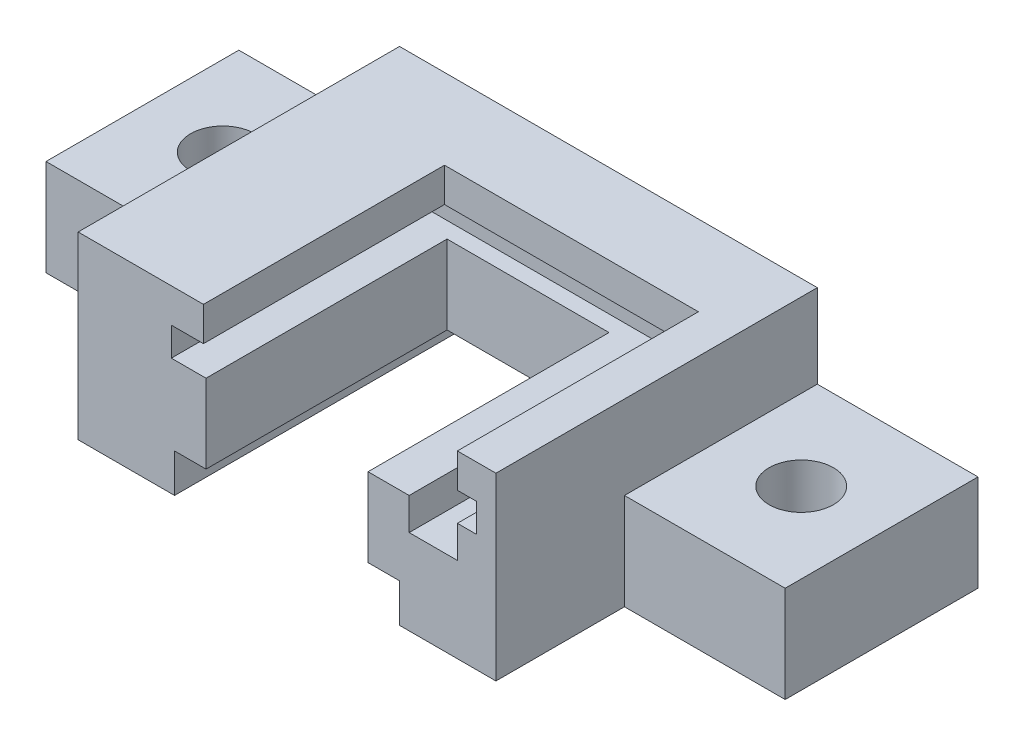
ISO-10303-21;
HEADER;
FILE_DESCRIPTION(('STEP AP214'),'2;1');
FILE_NAME('part.step','',(''),(''),'','','');
FILE_SCHEMA(('AUTOMOTIVE_DESIGN { 1 0 10303 214 1 1 1 1 }'));
ENDSEC;
DATA;
#1=APPLICATION_CONTEXT('core data for automotive mechanical design processes');
#2=APPLICATION_PROTOCOL_DEFINITION('international standard','automotive_design',2000,#1);
#3=PRODUCT_CONTEXT('',#1,'mechanical');
#4=PRODUCT('Part','Part','',(#3));
#5=PRODUCT_RELATED_PRODUCT_CATEGORY('part','',(#4));
#6=PRODUCT_DEFINITION_FORMATION('','',#4);
#7=PRODUCT_DEFINITION_CONTEXT('part definition',#1,'design');
#8=PRODUCT_DEFINITION('design','',#6,#7);
#9=PRODUCT_DEFINITION_SHAPE('','',#8);
#10=(LENGTH_UNIT() NAMED_UNIT(*) SI_UNIT(.MILLI.,.METRE.));
#11=(NAMED_UNIT(*) PLANE_ANGLE_UNIT() SI_UNIT($,.RADIAN.));
#12=(NAMED_UNIT(*) SI_UNIT($,.STERADIAN.) SOLID_ANGLE_UNIT());
#13=UNCERTAINTY_MEASURE_WITH_UNIT(LENGTH_MEASURE(1.E-05),#10,'distance_accuracy_value','');
#14=(GEOMETRIC_REPRESENTATION_CONTEXT(3) GLOBAL_UNCERTAINTY_ASSIGNED_CONTEXT((#13)) GLOBAL_UNIT_ASSIGNED_CONTEXT((#10,
#11,#12)) REPRESENTATION_CONTEXT('',''));
#15=CARTESIAN_POINT('',(0.,0.,0.));
#16=DIRECTION('',(0.,0.,1.));
#17=DIRECTION('',(1.,0.,0.));
#18=AXIS2_PLACEMENT_3D('',#15,#16,#17);
#19=CARTESIAN_POINT('',(13.,5.6,20.));
#20=DIRECTION('',(-1.,0.,0.));
#21=DIRECTION('',(0.,-1.,0.));
#22=AXIS2_PLACEMENT_3D('',#19,#20,#21);
#23=PLANE('',#22);
#24=DIRECTION('',(0.,-1.,0.));
#25=VECTOR('',#24,1.);
#26=CARTESIAN_POINT('',(13.,-5.6,12.));
#27=LINE('',#26,#25);
#28=CARTESIAN_POINT('',(13.,0.400000000000004,12.));
#29=VERTEX_POINT('',#28);
#30=CARTESIAN_POINT('',(13.,-5.6,12.));
#31=VERTEX_POINT('',#30);
#32=EDGE_CURVE('E257',#29,#31,#27,.T.);
#33=ORIENTED_EDGE('',*,*,#32,.F.);
#34=DIRECTION('',(0.,0.,1.));
#35=VECTOR('',#34,1.);
#36=CARTESIAN_POINT('',(13.,0.400000000000004,12.));
#37=LINE('',#36,#35);
#38=CARTESIAN_POINT('',(13.,0.400000000000004,0.));
#39=VERTEX_POINT('',#38);
#40=EDGE_CURVE('E58',#39,#29,#37,.T.);
#41=ORIENTED_EDGE('',*,*,#40,.F.);
#42=DIRECTION('',(0.,1.,0.));
#43=VECTOR('',#42,1.);
#44=CARTESIAN_POINT('',(13.,5.6,0.));
#45=LINE('',#44,#43);
#46=CARTESIAN_POINT('',(13.,5.6,0.));
#47=VERTEX_POINT('',#46);
#48=EDGE_CURVE('E311',#39,#47,#45,.T.);
#49=ORIENTED_EDGE('',*,*,#48,.T.);
#50=DIRECTION('',(0.,0.,-1.));
#51=VECTOR('',#50,1.);
#52=CARTESIAN_POINT('',(13.,5.6,20.));
#53=LINE('',#52,#51);
#54=CARTESIAN_POINT('',(13.,5.6,20.));
#55=VERTEX_POINT('',#54);
#56=EDGE_CURVE('E327',#55,#47,#53,.T.);
#57=ORIENTED_EDGE('',*,*,#56,.F.);
#58=DIRECTION('',(0.,1.,0.));
#59=VECTOR('',#58,1.);
#60=CARTESIAN_POINT('',(13.,5.6,20.));
#61=LINE('',#60,#59);
#62=CARTESIAN_POINT('',(13.,-5.6,20.));
#63=VERTEX_POINT('',#62);
#64=EDGE_CURVE('E346',#63,#55,#61,.T.);
#65=ORIENTED_EDGE('',*,*,#64,.F.);
#66=DIRECTION('',(0.,0.,-1.));
#67=VECTOR('',#66,1.);
#68=CARTESIAN_POINT('',(13.,-5.6,20.));
#69=LINE('',#68,#67);
#70=EDGE_CURVE('E52',#63,#31,#69,.T.);
#71=ORIENTED_EDGE('',*,*,#70,.T.);
#72=EDGE_LOOP('',(#33,#41,#49,#57,#65,#71));
#73=FACE_BOUND('',#72,.T.);
#74=ADVANCED_FACE('F35',(#73),#23,.F.);
#75=CARTESIAN_POINT('',(-13.,5.6,20.));
#76=DIRECTION('',(1.,0.,0.));
#77=DIRECTION('',(0.,1.,0.));
#78=AXIS2_PLACEMENT_3D('',#75,#76,#77);
#79=PLANE('',#78);
#80=DIRECTION('',(0.,1.,0.));
#81=VECTOR('',#80,1.);
#82=CARTESIAN_POINT('',(-13.,0.400000000000004,12.));
#83=LINE('',#82,#81);
#84=CARTESIAN_POINT('',(-13.,-5.6,12.));
#85=VERTEX_POINT('',#84);
#86=CARTESIAN_POINT('',(-13.,0.400000000000004,12.));
#87=VERTEX_POINT('',#86);
#88=EDGE_CURVE('E258',#85,#87,#83,.T.);
#89=ORIENTED_EDGE('',*,*,#88,.F.);
#90=DIRECTION('',(0.,0.,-1.));
#91=VECTOR('',#90,1.);
#92=CARTESIAN_POINT('',(-13.,-5.6,20.));
#93=LINE('',#92,#91);
#94=CARTESIAN_POINT('',(-13.,-5.6,20.));
#95=VERTEX_POINT('',#94);
#96=EDGE_CURVE('E44',#95,#85,#93,.T.);
#97=ORIENTED_EDGE('',*,*,#96,.F.);
#98=DIRECTION('',(0.,-1.,0.));
#99=VECTOR('',#98,1.);
#100=CARTESIAN_POINT('',(-13.,5.6,20.));
#101=LINE('',#100,#99);
#102=CARTESIAN_POINT('',(-13.,5.6,20.));
#103=VERTEX_POINT('',#102);
#104=EDGE_CURVE('E323',#103,#95,#101,.T.);
#105=ORIENTED_EDGE('',*,*,#104,.F.);
#106=DIRECTION('',(0.,0.,-1.));
#107=VECTOR('',#106,1.);
#108=CARTESIAN_POINT('',(-13.,5.6,20.));
#109=LINE('',#108,#107);
#110=CARTESIAN_POINT('',(-13.,5.6,0.));
#111=VERTEX_POINT('',#110);
#112=EDGE_CURVE('E324',#103,#111,#109,.T.);
#113=ORIENTED_EDGE('',*,*,#112,.T.);
#114=DIRECTION('',(0.,-1.,0.));
#115=VECTOR('',#114,1.);
#116=CARTESIAN_POINT('',(-13.,5.6,0.));
#117=LINE('',#116,#115);
#118=CARTESIAN_POINT('',(-13.,0.400000000000002,0.));
#119=VERTEX_POINT('',#118);
#120=EDGE_CURVE('E339',#111,#119,#117,.T.);
#121=ORIENTED_EDGE('',*,*,#120,.T.);
#122=DIRECTION('',(0.,0.,-1.));
#123=VECTOR('',#122,1.);
#124=CARTESIAN_POINT('',(-13.,0.400000000000004,12.));
#125=LINE('',#124,#123);
#126=EDGE_CURVE('E262',#87,#119,#125,.T.);
#127=ORIENTED_EDGE('',*,*,#126,.F.);
#128=EDGE_LOOP('',(#89,#97,#105,#113,#121,#127));
#129=FACE_BOUND('',#128,.T.);
#130=ADVANCED_FACE('F37',(#129),#79,.F.);
#131=CARTESIAN_POINT('',(0.,0.,20.));
#132=DIRECTION('',(0.,0.,1.));
#133=DIRECTION('',(1.,0.,0.));
#134=AXIS2_PLACEMENT_3D('',#131,#132,#133);
#135=PLANE('',#134);
#136=DIRECTION('',(0.,-1.,0.));
#137=VECTOR('',#136,1.);
#138=CARTESIAN_POINT('',(-5.2,5.6,20.));
#139=LINE('',#138,#137);
#140=CARTESIAN_POINT('',(-5.2,5.6,20.));
#141=VERTEX_POINT('',#140);
#142=CARTESIAN_POINT('',(-5.2,3.48000000000001,20.));
#143=VERTEX_POINT('',#142);
#144=EDGE_CURVE('E457',#141,#143,#139,.T.);
#145=ORIENTED_EDGE('',*,*,#144,.F.);
#146=DIRECTION('',(-1.,0.,0.));
#147=VECTOR('',#146,1.);
#148=CARTESIAN_POINT('',(-13.,5.6,20.));
#149=LINE('',#148,#147);
#150=EDGE_CURVE('E345',#141,#103,#149,.T.);
#151=ORIENTED_EDGE('',*,*,#150,.T.);
#152=ORIENTED_EDGE('',*,*,#104,.T.);
#153=DIRECTION('',(1.,0.,0.));
#154=VECTOR('',#153,1.);
#155=CARTESIAN_POINT('',(-13.,-5.6,20.));
#156=LINE('',#155,#154);
#157=CARTESIAN_POINT('',(-6.99999999999999,-5.6,20.));
#158=VERTEX_POINT('',#157);
#159=EDGE_CURVE('E348',#95,#158,#156,.T.);
#160=ORIENTED_EDGE('',*,*,#159,.T.);
#161=DIRECTION('',(0.,-1.,0.));
#162=VECTOR('',#161,1.);
#163=CARTESIAN_POINT('',(-6.99999999999999,-3.2,20.));
#164=LINE('',#163,#162);
#165=CARTESIAN_POINT('',(-6.99999999999999,-3.2,20.));
#166=VERTEX_POINT('',#165);
#167=EDGE_CURVE('E372',#166,#158,#164,.T.);
#168=ORIENTED_EDGE('',*,*,#167,.F.);
#169=DIRECTION('',(-1.,0.,0.));
#170=VECTOR('',#169,1.);
#171=CARTESIAN_POINT('',(-6.99999999999999,-3.2,20.));
#172=LINE('',#171,#170);
#173=CARTESIAN_POINT('',(-5.04,-3.2,20.));
#174=VERTEX_POINT('',#173);
#175=EDGE_CURVE('E368',#174,#166,#172,.T.);
#176=ORIENTED_EDGE('',*,*,#175,.F.);
#177=DIRECTION('',(0.,-1.,0.));
#178=VECTOR('',#177,1.);
#179=CARTESIAN_POINT('',(-5.04,1.7,20.));
#180=LINE('',#179,#178);
#181=CARTESIAN_POINT('',(-5.04,1.7,20.));
#182=VERTEX_POINT('',#181);
#183=EDGE_CURVE('E396',#182,#174,#180,.T.);
#184=ORIENTED_EDGE('',*,*,#183,.F.);
#185=DIRECTION('',(1.,0.,0.));
#186=VECTOR('',#185,1.);
#187=CARTESIAN_POINT('',(-7.2,1.7,20.));
#188=LINE('',#187,#186);
#189=CARTESIAN_POINT('',(-7.2,1.7,20.));
#190=VERTEX_POINT('',#189);
#191=EDGE_CURVE('E426',#190,#182,#188,.T.);
#192=ORIENTED_EDGE('',*,*,#191,.F.);
#193=DIRECTION('',(0.,-1.,0.));
#194=VECTOR('',#193,1.);
#195=CARTESIAN_POINT('',(-7.2,3.48000000000001,20.));
#196=LINE('',#195,#194);
#197=CARTESIAN_POINT('',(-7.2,3.48000000000001,20.));
#198=VERTEX_POINT('',#197);
#199=EDGE_CURVE('E430',#198,#190,#196,.T.);
#200=ORIENTED_EDGE('',*,*,#199,.F.);
#201=DIRECTION('',(-1.,0.,0.));
#202=VECTOR('',#201,1.);
#203=CARTESIAN_POINT('',(-7.2,3.48000000000001,20.));
#204=LINE('',#203,#202);
#205=EDGE_CURVE('E422',#143,#198,#204,.T.);
#206=ORIENTED_EDGE('',*,*,#205,.F.);
#207=EDGE_LOOP('',(#145,#151,#152,#160,#168,#176,#184,#192,#200,#206));
#208=FACE_BOUND('',#207,.T.);
#209=ADVANCED_FACE('F521',(#208),#135,.T.);
#210=CARTESIAN_POINT('',(-13.,-5.6,20.));
#211=DIRECTION('',(0.,1.,0.));
#212=DIRECTION('',(0.,0.,1.));
#213=AXIS2_PLACEMENT_3D('',#210,#211,#212);
#214=PLANE('',#213);
#215=CARTESIAN_POINT('',(-18.,-5.6,6.));
#216=DIRECTION('',(0.,-1.,0.));
#217=DIRECTION('',(0.,0.,-1.));
#218=AXIS2_PLACEMENT_3D('',#215,#216,#217);
#219=CIRCLE('',#218,2.);
#220=CARTESIAN_POINT('',(-18.,-5.6,4.));
#221=VERTEX_POINT('',#220);
#222=EDGE_CURVE('E584',#221,#221,#219,.T.);
#223=ORIENTED_EDGE('',*,*,#222,.F.);
#224=EDGE_LOOP('',(#223));
#225=FACE_BOUND('',#224,.T.);
#226=CARTESIAN_POINT('',(-10.,-5.6,15.));
#227=DIRECTION('',(0.,1.,0.));
#228=DIRECTION('',(0.,0.,1.));
#229=AXIS2_PLACEMENT_3D('',#226,#227,#228);
#230=CIRCLE('',#229,1.5);
#231=CARTESIAN_POINT('',(-10.,-5.6,16.5));
#232=VERTEX_POINT('',#231);
#233=EDGE_CURVE('E333',#232,#232,#230,.T.);
#234=ORIENTED_EDGE('',*,*,#233,.T.);
#235=EDGE_LOOP('',(#234));
#236=FACE_BOUND('',#235,.T.);
#237=CARTESIAN_POINT('',(-10.,-5.6,5.));
#238=DIRECTION('',(0.,1.,0.));
#239=DIRECTION('',(0.,0.,-1.));
#240=AXIS2_PLACEMENT_3D('',#237,#238,#239);
#241=CIRCLE('',#240,1.55);
#242=CARTESIAN_POINT('',(-10.,-5.60000000000001,3.45));
#243=VERTEX_POINT('',#242);
#244=EDGE_CURVE('E336',#243,#243,#241,.T.);
#245=ORIENTED_EDGE('',*,*,#244,.T.);
#246=EDGE_LOOP('',(#245));
#247=FACE_BOUND('',#246,.T.);
#248=DIRECTION('',(1.,0.,0.));
#249=VECTOR('',#248,1.);
#250=CARTESIAN_POINT('',(-13.,-5.6,0.));
#251=LINE('',#250,#249);
#252=CARTESIAN_POINT('',(-23.,-5.6,0.));
#253=VERTEX_POINT('',#252);
#254=CARTESIAN_POINT('',(-6.99999999999999,-5.6,0.));
#255=VERTEX_POINT('',#254);
#256=EDGE_CURVE('E315',#253,#255,#251,.T.);
#257=ORIENTED_EDGE('',*,*,#256,.T.);
#258=DIRECTION('',(0.,0.,1.));
#259=VECTOR('',#258,1.);
#260=CARTESIAN_POINT('',(-6.99999999999999,-5.6,0.));
#261=LINE('',#260,#259);
#262=EDGE_CURVE('E354',#255,#158,#261,.T.);
#263=ORIENTED_EDGE('',*,*,#262,.T.);
#264=ORIENTED_EDGE('',*,*,#159,.F.);
#265=ORIENTED_EDGE('',*,*,#96,.T.);
#266=DIRECTION('',(1.,0.,0.));
#267=VECTOR('',#266,1.);
#268=CARTESIAN_POINT('',(-23.,-5.59999999999999,12.));
#269=LINE('',#268,#267);
#270=CARTESIAN_POINT('',(-23.,-5.59999999999999,12.));
#271=VERTEX_POINT('',#270);
#272=EDGE_CURVE('E289',#271,#85,#269,.T.);
#273=ORIENTED_EDGE('',*,*,#272,.F.);
#274=DIRECTION('',(0.,0.,1.));
#275=VECTOR('',#274,1.);
#276=CARTESIAN_POINT('',(-23.,-5.59999999999999,12.));
#277=LINE('',#276,#275);
#278=EDGE_CURVE('E287',#253,#271,#277,.T.);
#279=ORIENTED_EDGE('',*,*,#278,.F.);
#280=EDGE_LOOP('',(#257,#263,#264,#265,#273,#279));
#281=FACE_BOUND('',#280,.T.);
#282=ADVANCED_FACE('F498',(#225,#236,#247,#281),#214,.F.);
#283=CARTESIAN_POINT('',(18.,-5.6,6.));
#284=DIRECTION('',(0.,-1.,0.));
#285=DIRECTION('',(0.,0.,-1.));
#286=AXIS2_PLACEMENT_3D('',#283,#284,#285);
#287=CIRCLE('',#286,2.);
#288=CARTESIAN_POINT('',(18.,-5.6,4.));
#289=VERTEX_POINT('',#288);
#290=EDGE_CURVE('E538',#289,#289,#287,.T.);
#291=ORIENTED_EDGE('',*,*,#290,.F.);
#292=EDGE_LOOP('',(#291));
#293=FACE_BOUND('',#292,.T.);
#294=CARTESIAN_POINT('',(10.,-5.6,5.));
#295=DIRECTION('',(0.,1.,0.));
#296=DIRECTION('',(0.,0.,1.));
#297=AXIS2_PLACEMENT_3D('',#294,#295,#296);
#298=CIRCLE('',#297,1.5);
#299=CARTESIAN_POINT('',(10.,-5.6,6.5));
#300=VERTEX_POINT('',#299);
#301=EDGE_CURVE('E11',#300,#300,#298,.F.);
#302=ORIENTED_EDGE('',*,*,#301,.F.);
#303=EDGE_LOOP('',(#302));
#304=FACE_BOUND('',#303,.T.);
#305=CARTESIAN_POINT('',(10.,-5.6,15.));
#306=DIRECTION('',(0.,1.,0.));
#307=DIRECTION('',(0.,0.,1.));
#308=AXIS2_PLACEMENT_3D('',#305,#306,#307);
#309=CIRCLE('',#308,1.55);
#310=CARTESIAN_POINT('',(10.,-5.6,16.55));
#311=VERTEX_POINT('',#310);
#312=EDGE_CURVE('E337',#311,#311,#309,.F.);
#313=ORIENTED_EDGE('',*,*,#312,.F.);
#314=EDGE_LOOP('',(#313));
#315=FACE_BOUND('',#314,.T.);
#316=CARTESIAN_POINT('',(7.00000000000001,-5.6,20.));
#317=VERTEX_POINT('',#316);
#318=EDGE_CURVE('E351',#317,#63,#156,.T.);
#319=ORIENTED_EDGE('',*,*,#318,.F.);
#320=DIRECTION('',(0.,0.,1.));
#321=VECTOR('',#320,1.);
#322=CARTESIAN_POINT('',(7.00000000000001,-5.6,0.));
#323=LINE('',#322,#321);
#324=CARTESIAN_POINT('',(7.00000000000001,-5.6,0.));
#325=VERTEX_POINT('',#324);
#326=EDGE_CURVE('E357',#325,#317,#323,.T.);
#327=ORIENTED_EDGE('',*,*,#326,.F.);
#328=CARTESIAN_POINT('',(23.,-5.59999999999999,0.));
#329=VERTEX_POINT('',#328);
#330=EDGE_CURVE('E242',#325,#329,#251,.T.);
#331=ORIENTED_EDGE('',*,*,#330,.T.);
#332=DIRECTION('',(0.,0.,-1.));
#333=VECTOR('',#332,1.);
#334=CARTESIAN_POINT('',(23.,-5.59999999999999,12.));
#335=LINE('',#334,#333);
#336=CARTESIAN_POINT('',(23.,-5.59999999999999,12.));
#337=VERTEX_POINT('',#336);
#338=EDGE_CURVE('E233',#337,#329,#335,.T.);
#339=ORIENTED_EDGE('',*,*,#338,.F.);
#340=DIRECTION('',(-1.,0.,0.));
#341=VECTOR('',#340,1.);
#342=CARTESIAN_POINT('',(23.,-5.59999999999999,12.));
#343=LINE('',#342,#341);
#344=EDGE_CURVE('E238',#337,#31,#343,.T.);
#345=ORIENTED_EDGE('',*,*,#344,.T.);
#346=ORIENTED_EDGE('',*,*,#70,.F.);
#347=EDGE_LOOP('',(#319,#327,#331,#339,#345,#346));
#348=FACE_BOUND('',#347,.T.);
#349=ADVANCED_FACE('F236',(#293,#304,#315,#348),#214,.F.);
#350=CARTESIAN_POINT('',(-13.,5.6,20.));
#351=DIRECTION('',(0.,-1.,0.));
#352=DIRECTION('',(0.,0.,-1.));
#353=AXIS2_PLACEMENT_3D('',#350,#351,#352);
#354=PLANE('',#353);
#355=ORIENTED_EDGE('',*,*,#150,.F.);
#356=DIRECTION('',(0.,0.,1.));
#357=VECTOR('',#356,1.);
#358=CARTESIAN_POINT('',(-5.2,5.6,5.));
#359=LINE('',#358,#357);
#360=CARTESIAN_POINT('',(-5.2,5.6,5.));
#361=VERTEX_POINT('',#360);
#362=EDGE_CURVE('E433',#361,#141,#359,.T.);
#363=ORIENTED_EDGE('',*,*,#362,.F.);
#364=DIRECTION('',(-1.,0.,0.));
#365=VECTOR('',#364,1.);
#366=CARTESIAN_POINT('',(-5.2,5.6,5.));
#367=LINE('',#366,#365);
#368=CARTESIAN_POINT('',(10.6,5.6,5.));
#369=VERTEX_POINT('',#368);
#370=EDGE_CURVE('E448',#369,#361,#367,.T.);
#371=ORIENTED_EDGE('',*,*,#370,.F.);
#372=DIRECTION('',(0.,0.,1.));
#373=VECTOR('',#372,1.);
#374=CARTESIAN_POINT('',(10.6,5.6,5.));
#375=LINE('',#374,#373);
#376=CARTESIAN_POINT('',(10.6,5.6,20.));
#377=VERTEX_POINT('',#376);
#378=EDGE_CURVE('E450',#369,#377,#375,.T.);
#379=ORIENTED_EDGE('',*,*,#378,.T.);
#380=EDGE_CURVE('E328',#55,#377,#149,.T.);
#381=ORIENTED_EDGE('',*,*,#380,.F.);
#382=ORIENTED_EDGE('',*,*,#56,.T.);
#383=DIRECTION('',(-1.,0.,0.));
#384=VECTOR('',#383,1.);
#385=CARTESIAN_POINT('',(-13.,5.6,0.));
#386=LINE('',#385,#384);
#387=EDGE_CURVE('E314',#47,#111,#386,.T.);
#388=ORIENTED_EDGE('',*,*,#387,.T.);
#389=ORIENTED_EDGE('',*,*,#112,.F.);
#390=EDGE_LOOP('',(#355,#363,#371,#379,#381,#382,#388,#389));
#391=FACE_BOUND('',#390,.T.);
#392=ADVANCED_FACE('F524',(#391),#354,.F.);
#393=DIRECTION('',(0.,-1.,0.));
#394=VECTOR('',#393,1.);
#395=CARTESIAN_POINT('',(7.6,1.7,20.));
#396=LINE('',#395,#394);
#397=CARTESIAN_POINT('',(7.6,1.7,20.));
#398=VERTEX_POINT('',#397);
#399=CARTESIAN_POINT('',(7.6,-0.299999999999995,20.));
#400=VERTEX_POINT('',#399);
#401=EDGE_CURVE('E484',#398,#400,#396,.T.);
#402=ORIENTED_EDGE('',*,*,#401,.F.);
#403=CARTESIAN_POINT('',(5.04,1.7,20.));
#404=VERTEX_POINT('',#403);
#405=EDGE_CURVE('E428',#404,#398,#188,.T.);
#406=ORIENTED_EDGE('',*,*,#405,.F.);
#407=DIRECTION('',(0.,1.,0.));
#408=VECTOR('',#407,1.);
#409=CARTESIAN_POINT('',(5.04,1.7,20.));
#410=LINE('',#409,#408);
#411=CARTESIAN_POINT('',(5.04,-3.2,20.));
#412=VERTEX_POINT('',#411);
#413=EDGE_CURVE('E392',#412,#404,#410,.T.);
#414=ORIENTED_EDGE('',*,*,#413,.F.);
#415=CARTESIAN_POINT('',(7.00000000000001,-3.2,20.));
#416=VERTEX_POINT('',#415);
#417=EDGE_CURVE('E364',#416,#412,#172,.T.);
#418=ORIENTED_EDGE('',*,*,#417,.F.);
#419=DIRECTION('',(0.,1.,0.));
#420=VECTOR('',#419,1.);
#421=CARTESIAN_POINT('',(7.00000000000001,-3.2,20.));
#422=LINE('',#421,#420);
#423=EDGE_CURVE('E369',#317,#416,#422,.T.);
#424=ORIENTED_EDGE('',*,*,#423,.F.);
#425=ORIENTED_EDGE('',*,*,#318,.T.);
#426=ORIENTED_EDGE('',*,*,#64,.T.);
#427=ORIENTED_EDGE('',*,*,#380,.T.);
#428=DIRECTION('',(0.,1.,0.));
#429=VECTOR('',#428,1.);
#430=CARTESIAN_POINT('',(10.6,5.6,20.));
#431=LINE('',#430,#429);
#432=CARTESIAN_POINT('',(10.6,3.48000000000001,20.));
#433=VERTEX_POINT('',#432);
#434=EDGE_CURVE('E454',#433,#377,#431,.T.);
#435=ORIENTED_EDGE('',*,*,#434,.F.);
#436=CARTESIAN_POINT('',(11.8,3.48,20.));
#437=VERTEX_POINT('',#436);
#438=EDGE_CURVE('E418',#437,#433,#204,.T.);
#439=ORIENTED_EDGE('',*,*,#438,.F.);
#440=DIRECTION('',(0.,1.,0.));
#441=VECTOR('',#440,1.);
#442=CARTESIAN_POINT('',(11.8,3.48,20.));
#443=LINE('',#442,#441);
#444=CARTESIAN_POINT('',(11.8,1.7,20.));
#445=VERTEX_POINT('',#444);
#446=EDGE_CURVE('E423',#445,#437,#443,.T.);
#447=ORIENTED_EDGE('',*,*,#446,.F.);
#448=CARTESIAN_POINT('',(10.6,1.7,20.));
#449=VERTEX_POINT('',#448);
#450=EDGE_CURVE('E429',#449,#445,#188,.T.);
#451=ORIENTED_EDGE('',*,*,#450,.F.);
#452=DIRECTION('',(0.,1.,0.));
#453=VECTOR('',#452,1.);
#454=CARTESIAN_POINT('',(10.6,1.7,20.));
#455=LINE('',#454,#453);
#456=CARTESIAN_POINT('',(10.6,-0.299999999999995,20.));
#457=VERTEX_POINT('',#456);
#458=EDGE_CURVE('E478',#457,#449,#455,.T.);
#459=ORIENTED_EDGE('',*,*,#458,.F.);
#460=DIRECTION('',(1.,0.,0.));
#461=VECTOR('',#460,1.);
#462=CARTESIAN_POINT('',(7.6,-0.299999999999995,20.));
#463=LINE('',#462,#461);
#464=EDGE_CURVE('E481',#400,#457,#463,.T.);
#465=ORIENTED_EDGE('',*,*,#464,.F.);
#466=EDGE_LOOP('',(#402,#406,#414,#418,#424,#425,#426,#427,#435,#439,#447,#451,#459,#465));
#467=FACE_BOUND('',#466,.T.);
#468=ADVANCED_FACE('F532',(#467),#135,.T.);
#469=CARTESIAN_POINT('',(0.,0.,0.));
#470=DIRECTION('',(0.,0.,1.));
#471=DIRECTION('',(1.,0.,0.));
#472=AXIS2_PLACEMENT_3D('',#469,#470,#471);
#473=PLANE('',#472);
#474=DIRECTION('',(-1.,0.,0.));
#475=VECTOR('',#474,1.);
#476=CARTESIAN_POINT('',(-6.99999999999999,-3.2,0.));
#477=LINE('',#476,#475);
#478=CARTESIAN_POINT('',(7.00000000000001,-3.2,0.));
#479=VERTEX_POINT('',#478);
#480=CARTESIAN_POINT('',(-6.99999999999999,-3.2,0.));
#481=VERTEX_POINT('',#480);
#482=EDGE_CURVE('E358',#479,#481,#477,.T.);
#483=ORIENTED_EDGE('',*,*,#482,.T.);
#484=DIRECTION('',(0.,-1.,0.));
#485=VECTOR('',#484,1.);
#486=CARTESIAN_POINT('',(-6.99999999999999,-3.2,0.));
#487=LINE('',#486,#485);
#488=EDGE_CURVE('E367',#481,#255,#487,.T.);
#489=ORIENTED_EDGE('',*,*,#488,.T.);
#490=ORIENTED_EDGE('',*,*,#256,.F.);
#491=DIRECTION('',(0.,-1.,0.));
#492=VECTOR('',#491,1.);
#493=CARTESIAN_POINT('',(-23.,0.400000000000004,0.));
#494=LINE('',#493,#492);
#495=CARTESIAN_POINT('',(-23.,0.400000000000004,0.));
#496=VERTEX_POINT('',#495);
#497=EDGE_CURVE('E284',#496,#253,#494,.T.);
#498=ORIENTED_EDGE('',*,*,#497,.F.);
#499=DIRECTION('',(1.,0.,0.));
#500=VECTOR('',#499,1.);
#501=CARTESIAN_POINT('',(-23.,0.400000000000004,0.));
#502=LINE('',#501,#500);
#503=EDGE_CURVE('E300',#496,#119,#502,.T.);
#504=ORIENTED_EDGE('',*,*,#503,.T.);
#505=ORIENTED_EDGE('',*,*,#120,.F.);
#506=ORIENTED_EDGE('',*,*,#387,.F.);
#507=ORIENTED_EDGE('',*,*,#48,.F.);
#508=DIRECTION('',(-1.,0.,0.));
#509=VECTOR('',#508,1.);
#510=CARTESIAN_POINT('',(23.,0.400000000000006,0.));
#511=LINE('',#510,#509);
#512=CARTESIAN_POINT('',(23.,0.400000000000006,0.));
#513=VERTEX_POINT('',#512);
#514=EDGE_CURVE('E259',#513,#39,#511,.T.);
#515=ORIENTED_EDGE('',*,*,#514,.F.);
#516=DIRECTION('',(0.,1.,0.));
#517=VECTOR('',#516,1.);
#518=CARTESIAN_POINT('',(23.,-5.59999999999999,0.));
#519=LINE('',#518,#517);
#520=EDGE_CURVE('E245',#329,#513,#519,.T.);
#521=ORIENTED_EDGE('',*,*,#520,.F.);
#522=ORIENTED_EDGE('',*,*,#330,.F.);
#523=DIRECTION('',(0.,1.,0.));
#524=VECTOR('',#523,1.);
#525=CARTESIAN_POINT('',(7.00000000000001,-3.2,0.));
#526=LINE('',#525,#524);
#527=EDGE_CURVE('E377',#325,#479,#526,.T.);
#528=ORIENTED_EDGE('',*,*,#527,.T.);
#529=EDGE_LOOP('',(#483,#489,#490,#498,#504,#505,#506,#507,#515,#521,#522,#528));
#530=FACE_BOUND('',#529,.T.);
#531=ADVANCED_FACE('F590',(#530),#473,.F.);
#532=CARTESIAN_POINT('',(-6.99999999999999,-3.2,0.));
#533=DIRECTION('',(-1.,0.,0.));
#534=DIRECTION('',(0.,-1.,0.));
#535=AXIS2_PLACEMENT_3D('',#532,#533,#534);
#536=PLANE('',#535);
#537=ORIENTED_EDGE('',*,*,#167,.T.);
#538=ORIENTED_EDGE('',*,*,#262,.F.);
#539=ORIENTED_EDGE('',*,*,#488,.F.);
#540=DIRECTION('',(0.,0.,1.));
#541=VECTOR('',#540,1.);
#542=CARTESIAN_POINT('',(-6.99999999999999,-3.2,0.));
#543=LINE('',#542,#541);
#544=EDGE_CURVE('E340',#481,#166,#543,.T.);
#545=ORIENTED_EDGE('',*,*,#544,.T.);
#546=EDGE_LOOP('',(#537,#538,#539,#545));
#547=FACE_BOUND('',#546,.T.);
#548=ADVANCED_FACE('F620',(#547),#536,.F.);
#549=CARTESIAN_POINT('',(-6.99999999999999,-3.2,0.));
#550=DIRECTION('',(0.,1.,0.));
#551=DIRECTION('',(0.,0.,1.));
#552=AXIS2_PLACEMENT_3D('',#549,#550,#551);
#553=PLANE('',#552);
#554=DIRECTION('',(1.,0.,0.));
#555=VECTOR('',#554,1.);
#556=CARTESIAN_POINT('',(-5.04,-3.2,5.));
#557=LINE('',#556,#555);
#558=CARTESIAN_POINT('',(-5.04,-3.2,5.));
#559=VERTEX_POINT('',#558);
#560=CARTESIAN_POINT('',(5.04,-3.2,5.));
#561=VERTEX_POINT('',#560);
#562=EDGE_CURVE('E404',#559,#561,#557,.T.);
#563=ORIENTED_EDGE('',*,*,#562,.F.);
#564=DIRECTION('',(0.,0.,1.));
#565=VECTOR('',#564,1.);
#566=CARTESIAN_POINT('',(-5.04,-3.2,5.));
#567=LINE('',#566,#565);
#568=EDGE_CURVE('E382',#559,#174,#567,.T.);
#569=ORIENTED_EDGE('',*,*,#568,.T.);
#570=ORIENTED_EDGE('',*,*,#175,.T.);
#571=ORIENTED_EDGE('',*,*,#544,.F.);
#572=ORIENTED_EDGE('',*,*,#482,.F.);
#573=DIRECTION('',(0.,0.,1.));
#574=VECTOR('',#573,1.);
#575=CARTESIAN_POINT('',(7.00000000000001,-3.2,0.));
#576=LINE('',#575,#574);
#577=EDGE_CURVE('E360',#479,#416,#576,.T.);
#578=ORIENTED_EDGE('',*,*,#577,.T.);
#579=ORIENTED_EDGE('',*,*,#417,.T.);
#580=DIRECTION('',(0.,0.,1.));
#581=VECTOR('',#580,1.);
#582=CARTESIAN_POINT('',(5.04,-3.2,5.));
#583=LINE('',#582,#581);
#584=EDGE_CURVE('E385',#561,#412,#583,.T.);
#585=ORIENTED_EDGE('',*,*,#584,.F.);
#586=EDGE_LOOP('',(#563,#569,#570,#571,#572,#578,#579,#585));
#587=FACE_BOUND('',#586,.T.);
#588=ADVANCED_FACE('F665',(#587),#553,.F.);
#589=CARTESIAN_POINT('',(7.00000000000001,-3.2,0.));
#590=DIRECTION('',(1.,0.,0.));
#591=DIRECTION('',(0.,1.,0.));
#592=AXIS2_PLACEMENT_3D('',#589,#590,#591);
#593=PLANE('',#592);
#594=ORIENTED_EDGE('',*,*,#423,.T.);
#595=ORIENTED_EDGE('',*,*,#577,.F.);
#596=ORIENTED_EDGE('',*,*,#527,.F.);
#597=ORIENTED_EDGE('',*,*,#326,.T.);
#598=EDGE_LOOP('',(#594,#595,#596,#597));
#599=FACE_BOUND('',#598,.T.);
#600=ADVANCED_FACE('F668',(#599),#593,.F.);
#601=CARTESIAN_POINT('',(-5.04,1.7,5.));
#602=DIRECTION('',(-1.,0.,0.));
#603=DIRECTION('',(0.,-1.,0.));
#604=AXIS2_PLACEMENT_3D('',#601,#602,#603);
#605=PLANE('',#604);
#606=ORIENTED_EDGE('',*,*,#183,.T.);
#607=ORIENTED_EDGE('',*,*,#568,.F.);
#608=DIRECTION('',(0.,-1.,0.));
#609=VECTOR('',#608,1.);
#610=CARTESIAN_POINT('',(-5.04,1.7,5.));
#611=LINE('',#610,#609);
#612=CARTESIAN_POINT('',(-5.04,1.7,5.));
#613=VERTEX_POINT('',#612);
#614=EDGE_CURVE('E395',#613,#559,#611,.T.);
#615=ORIENTED_EDGE('',*,*,#614,.F.);
#616=DIRECTION('',(0.,0.,1.));
#617=VECTOR('',#616,1.);
#618=CARTESIAN_POINT('',(-5.04,1.7,5.));
#619=LINE('',#618,#617);
#620=EDGE_CURVE('E374',#613,#182,#619,.T.);
#621=ORIENTED_EDGE('',*,*,#620,.T.);
#622=EDGE_LOOP('',(#606,#607,#615,#621));
#623=FACE_BOUND('',#622,.T.);
#624=ADVANCED_FACE('F670',(#623),#605,.F.);
#625=CARTESIAN_POINT('',(5.04,1.7,5.));
#626=DIRECTION('',(1.,0.,0.));
#627=DIRECTION('',(0.,0.,-1.));
#628=AXIS2_PLACEMENT_3D('',#625,#626,#627);
#629=PLANE('',#628);
#630=ORIENTED_EDGE('',*,*,#413,.T.);
#631=DIRECTION('',(0.,0.,1.));
#632=VECTOR('',#631,1.);
#633=CARTESIAN_POINT('',(5.04,1.7,5.));
#634=LINE('',#633,#632);
#635=CARTESIAN_POINT('',(5.04,1.7,5.));
#636=VERTEX_POINT('',#635);
#637=EDGE_CURVE('E388',#636,#404,#634,.T.);
#638=ORIENTED_EDGE('',*,*,#637,.F.);
#639=DIRECTION('',(0.,1.,0.));
#640=VECTOR('',#639,1.);
#641=CARTESIAN_POINT('',(5.04,1.7,5.));
#642=LINE('',#641,#640);
#643=EDGE_CURVE('E401',#561,#636,#642,.T.);
#644=ORIENTED_EDGE('',*,*,#643,.F.);
#645=ORIENTED_EDGE('',*,*,#584,.T.);
#646=EDGE_LOOP('',(#630,#638,#644,#645));
#647=FACE_BOUND('',#646,.T.);
#648=ADVANCED_FACE('F661',(#647),#629,.F.);
#649=CARTESIAN_POINT('',(0.,0.,5.));
#650=DIRECTION('',(0.,0.,1.));
#651=DIRECTION('',(1.,0.,0.));
#652=AXIS2_PLACEMENT_3D('',#649,#650,#651);
#653=PLANE('',#652);
#654=ORIENTED_EDGE('',*,*,#614,.T.);
#655=ORIENTED_EDGE('',*,*,#562,.T.);
#656=ORIENTED_EDGE('',*,*,#643,.T.);
#657=DIRECTION('',(-1.,0.,0.));
#658=VECTOR('',#657,1.);
#659=CARTESIAN_POINT('',(-5.04,1.7,5.));
#660=LINE('',#659,#658);
#661=EDGE_CURVE('E386',#636,#613,#660,.T.);
#662=ORIENTED_EDGE('',*,*,#661,.T.);
#663=EDGE_LOOP('',(#654,#655,#656,#662));
#664=FACE_BOUND('',#663,.T.);
#665=ADVANCED_FACE('F714',(#664),#653,.T.);
#666=CARTESIAN_POINT('',(-7.2,1.7,4.));
#667=DIRECTION('',(0.,-1.,0.));
#668=DIRECTION('',(0.,0.,-1.));
#669=AXIS2_PLACEMENT_3D('',#666,#667,#668);
#670=PLANE('',#669);
#671=ORIENTED_EDGE('',*,*,#405,.T.);
#672=DIRECTION('',(0.,0.,1.));
#673=VECTOR('',#672,1.);
#674=CARTESIAN_POINT('',(7.6,1.7,5.));
#675=LINE('',#674,#673);
#676=CARTESIAN_POINT('',(7.6,1.7,5.));
#677=VERTEX_POINT('',#676);
#678=EDGE_CURVE('E459',#677,#398,#675,.T.);
#679=ORIENTED_EDGE('',*,*,#678,.F.);
#680=DIRECTION('',(-1.,0.,0.));
#681=VECTOR('',#680,1.);
#682=CARTESIAN_POINT('',(7.6,1.7,5.));
#683=LINE('',#682,#681);
#684=CARTESIAN_POINT('',(10.6,1.7,5.));
#685=VERTEX_POINT('',#684);
#686=EDGE_CURVE('E472',#685,#677,#683,.T.);
#687=ORIENTED_EDGE('',*,*,#686,.F.);
#688=DIRECTION('',(0.,0.,1.));
#689=VECTOR('',#688,1.);
#690=CARTESIAN_POINT('',(10.6,1.7,5.));
#691=LINE('',#690,#689);
#692=EDGE_CURVE('E474',#685,#449,#691,.T.);
#693=ORIENTED_EDGE('',*,*,#692,.T.);
#694=ORIENTED_EDGE('',*,*,#450,.T.);
#695=DIRECTION('',(0.,0.,1.));
#696=VECTOR('',#695,1.);
#697=CARTESIAN_POINT('',(11.8,1.7,4.));
#698=LINE('',#697,#696);
#699=CARTESIAN_POINT('',(11.8,1.7,4.));
#700=VERTEX_POINT('',#699);
#701=EDGE_CURVE('E410',#700,#445,#698,.T.);
#702=ORIENTED_EDGE('',*,*,#701,.F.);
#703=DIRECTION('',(1.,0.,0.));
#704=VECTOR('',#703,1.);
#705=CARTESIAN_POINT('',(-7.2,1.7,4.));
#706=LINE('',#705,#704);
#707=CARTESIAN_POINT('',(-7.2,1.7,4.));
#708=VERTEX_POINT('',#707);
#709=EDGE_CURVE('E439',#708,#700,#706,.T.);
#710=ORIENTED_EDGE('',*,*,#709,.F.);
#711=DIRECTION('',(0.,0.,1.));
#712=VECTOR('',#711,1.);
#713=CARTESIAN_POINT('',(-7.2,1.7,4.));
#714=LINE('',#713,#712);
#715=EDGE_CURVE('E408',#708,#190,#714,.T.);
#716=ORIENTED_EDGE('',*,*,#715,.T.);
#717=ORIENTED_EDGE('',*,*,#191,.T.);
#718=ORIENTED_EDGE('',*,*,#620,.F.);
#719=ORIENTED_EDGE('',*,*,#661,.F.);
#720=ORIENTED_EDGE('',*,*,#637,.T.);
#721=EDGE_LOOP('',(#671,#679,#687,#693,#694,#702,#710,#716,#717,#718,#719,#720));
#722=FACE_BOUND('',#721,.T.);
#723=ADVANCED_FACE('F656',(#722),#670,.F.);
#724=CARTESIAN_POINT('',(-7.2,3.48000000000001,4.));
#725=DIRECTION('',(-1.,0.,0.));
#726=DIRECTION('',(0.,0.,1.));
#727=AXIS2_PLACEMENT_3D('',#724,#725,#726);
#728=PLANE('',#727);
#729=ORIENTED_EDGE('',*,*,#199,.T.);
#730=ORIENTED_EDGE('',*,*,#715,.F.);
#731=DIRECTION('',(0.,-1.,0.));
#732=VECTOR('',#731,1.);
#733=CARTESIAN_POINT('',(-7.2,3.48000000000001,4.));
#734=LINE('',#733,#732);
#735=CARTESIAN_POINT('',(-7.2,3.48000000000001,4.));
#736=VERTEX_POINT('',#735);
#737=EDGE_CURVE('E421',#736,#708,#734,.T.);
#738=ORIENTED_EDGE('',*,*,#737,.F.);
#739=DIRECTION('',(0.,0.,1.));
#740=VECTOR('',#739,1.);
#741=CARTESIAN_POINT('',(-7.2,3.48000000000001,4.));
#742=LINE('',#741,#740);
#743=EDGE_CURVE('E398',#736,#198,#742,.T.);
#744=ORIENTED_EDGE('',*,*,#743,.T.);
#745=EDGE_LOOP('',(#729,#730,#738,#744));
#746=FACE_BOUND('',#745,.T.);
#747=ADVANCED_FACE('F640',(#746),#728,.F.);
#748=CARTESIAN_POINT('',(-7.2,3.48000000000001,4.));
#749=DIRECTION('',(0.,1.,0.));
#750=DIRECTION('',(-1.,0.,0.));
#751=AXIS2_PLACEMENT_3D('',#748,#749,#750);
#752=PLANE('',#751);
#753=DIRECTION('',(1.,0.,0.));
#754=VECTOR('',#753,1.);
#755=CARTESIAN_POINT('',(-5.2,3.48000000000001,5.));
#756=LINE('',#755,#754);
#757=CARTESIAN_POINT('',(-5.2,3.48000000000001,5.));
#758=VERTEX_POINT('',#757);
#759=CARTESIAN_POINT('',(10.6,3.48000000000001,5.));
#760=VERTEX_POINT('',#759);
#761=EDGE_CURVE('E465',#758,#760,#756,.T.);
#762=ORIENTED_EDGE('',*,*,#761,.F.);
#763=DIRECTION('',(0.,0.,1.));
#764=VECTOR('',#763,1.);
#765=CARTESIAN_POINT('',(-5.2,3.48000000000001,5.));
#766=LINE('',#765,#764);
#767=EDGE_CURVE('E444',#758,#143,#766,.T.);
#768=ORIENTED_EDGE('',*,*,#767,.T.);
#769=ORIENTED_EDGE('',*,*,#205,.T.);
#770=ORIENTED_EDGE('',*,*,#743,.F.);
#771=DIRECTION('',(-1.,0.,0.));
#772=VECTOR('',#771,1.);
#773=CARTESIAN_POINT('',(-7.2,3.48000000000001,4.));
#774=LINE('',#773,#772);
#775=CARTESIAN_POINT('',(11.8,3.48,4.));
#776=VERTEX_POINT('',#775);
#777=EDGE_CURVE('E411',#776,#736,#774,.T.);
#778=ORIENTED_EDGE('',*,*,#777,.F.);
#779=DIRECTION('',(0.,0.,1.));
#780=VECTOR('',#779,1.);
#781=CARTESIAN_POINT('',(11.8,3.48,4.));
#782=LINE('',#781,#780);
#783=EDGE_CURVE('E414',#776,#437,#782,.T.);
#784=ORIENTED_EDGE('',*,*,#783,.T.);
#785=ORIENTED_EDGE('',*,*,#438,.T.);
#786=DIRECTION('',(0.,0.,1.));
#787=VECTOR('',#786,1.);
#788=CARTESIAN_POINT('',(10.6,3.48000000000001,5.));
#789=LINE('',#788,#787);
#790=EDGE_CURVE('E447',#760,#433,#789,.T.);
#791=ORIENTED_EDGE('',*,*,#790,.F.);
#792=EDGE_LOOP('',(#762,#768,#769,#770,#778,#784,#785,#791));
#793=FACE_BOUND('',#792,.T.);
#794=ADVANCED_FACE('F636',(#793),#752,.F.);
#795=CARTESIAN_POINT('',(11.8,3.48,4.));
#796=DIRECTION('',(1.,0.,0.));
#797=DIRECTION('',(0.,1.,0.));
#798=AXIS2_PLACEMENT_3D('',#795,#796,#797);
#799=PLANE('',#798);
#800=ORIENTED_EDGE('',*,*,#446,.T.);
#801=ORIENTED_EDGE('',*,*,#783,.F.);
#802=DIRECTION('',(0.,1.,0.));
#803=VECTOR('',#802,1.);
#804=CARTESIAN_POINT('',(11.8,3.48,4.));
#805=LINE('',#804,#803);
#806=EDGE_CURVE('E436',#700,#776,#805,.T.);
#807=ORIENTED_EDGE('',*,*,#806,.F.);
#808=ORIENTED_EDGE('',*,*,#701,.T.);
#809=EDGE_LOOP('',(#800,#801,#807,#808));
#810=FACE_BOUND('',#809,.T.);
#811=ADVANCED_FACE('F648',(#810),#799,.F.);
#812=CARTESIAN_POINT('',(0.,0.,4.));
#813=DIRECTION('',(0.,0.,1.));
#814=DIRECTION('',(1.,0.,0.));
#815=AXIS2_PLACEMENT_3D('',#812,#813,#814);
#816=PLANE('',#815);
#817=ORIENTED_EDGE('',*,*,#737,.T.);
#818=ORIENTED_EDGE('',*,*,#709,.T.);
#819=ORIENTED_EDGE('',*,*,#806,.T.);
#820=ORIENTED_EDGE('',*,*,#777,.T.);
#821=EDGE_LOOP('',(#817,#818,#819,#820));
#822=FACE_BOUND('',#821,.T.);
#823=ADVANCED_FACE('F643',(#822),#816,.T.);
#824=CARTESIAN_POINT('',(-5.2,5.6,5.));
#825=DIRECTION('',(-1.,0.,0.));
#826=DIRECTION('',(0.,0.,1.));
#827=AXIS2_PLACEMENT_3D('',#824,#825,#826);
#828=PLANE('',#827);
#829=ORIENTED_EDGE('',*,*,#144,.T.);
#830=ORIENTED_EDGE('',*,*,#767,.F.);
#831=DIRECTION('',(0.,-1.,0.));
#832=VECTOR('',#831,1.);
#833=CARTESIAN_POINT('',(-5.2,5.6,5.));
#834=LINE('',#833,#832);
#835=EDGE_CURVE('E456',#361,#758,#834,.T.);
#836=ORIENTED_EDGE('',*,*,#835,.F.);
#837=ORIENTED_EDGE('',*,*,#362,.T.);
#838=EDGE_LOOP('',(#829,#830,#836,#837));
#839=FACE_BOUND('',#838,.T.);
#840=ADVANCED_FACE('F629',(#839),#828,.F.);
#841=CARTESIAN_POINT('',(10.6,5.6,5.));
#842=DIRECTION('',(1.,0.,0.));
#843=DIRECTION('',(0.,0.,-1.));
#844=AXIS2_PLACEMENT_3D('',#841,#842,#843);
#845=PLANE('',#844);
#846=ORIENTED_EDGE('',*,*,#434,.T.);
#847=ORIENTED_EDGE('',*,*,#378,.F.);
#848=DIRECTION('',(0.,1.,0.));
#849=VECTOR('',#848,1.);
#850=CARTESIAN_POINT('',(10.6,5.6,5.));
#851=LINE('',#850,#849);
#852=EDGE_CURVE('E462',#760,#369,#851,.T.);
#853=ORIENTED_EDGE('',*,*,#852,.F.);
#854=ORIENTED_EDGE('',*,*,#790,.T.);
#855=EDGE_LOOP('',(#846,#847,#853,#854));
#856=FACE_BOUND('',#855,.T.);
#857=ADVANCED_FACE('F781',(#856),#845,.F.);
#858=CARTESIAN_POINT('',(0.,0.,5.));
#859=DIRECTION('',(0.,0.,1.));
#860=DIRECTION('',(1.,0.,0.));
#861=AXIS2_PLACEMENT_3D('',#858,#859,#860);
#862=PLANE('',#861);
#863=ORIENTED_EDGE('',*,*,#835,.T.);
#864=ORIENTED_EDGE('',*,*,#761,.T.);
#865=ORIENTED_EDGE('',*,*,#852,.T.);
#866=ORIENTED_EDGE('',*,*,#370,.T.);
#867=EDGE_LOOP('',(#863,#864,#865,#866));
#868=FACE_BOUND('',#867,.T.);
#869=ADVANCED_FACE('F790',(#868),#862,.T.);
#870=CARTESIAN_POINT('',(7.6,1.7,5.));
#871=DIRECTION('',(-1.,0.,0.));
#872=DIRECTION('',(0.,0.,1.));
#873=AXIS2_PLACEMENT_3D('',#870,#871,#872);
#874=PLANE('',#873);
#875=ORIENTED_EDGE('',*,*,#401,.T.);
#876=DIRECTION('',(0.,0.,1.));
#877=VECTOR('',#876,1.);
#878=CARTESIAN_POINT('',(7.6,-0.299999999999995,5.));
#879=LINE('',#878,#877);
#880=CARTESIAN_POINT('',(7.6,-0.299999999999995,5.));
#881=VERTEX_POINT('',#880);
#882=EDGE_CURVE('E469',#881,#400,#879,.T.);
#883=ORIENTED_EDGE('',*,*,#882,.F.);
#884=DIRECTION('',(0.,-1.,0.));
#885=VECTOR('',#884,1.);
#886=CARTESIAN_POINT('',(7.6,1.7,5.));
#887=LINE('',#886,#885);
#888=EDGE_CURVE('E480',#677,#881,#887,.T.);
#889=ORIENTED_EDGE('',*,*,#888,.F.);
#890=ORIENTED_EDGE('',*,*,#678,.T.);
#891=EDGE_LOOP('',(#875,#883,#889,#890));
#892=FACE_BOUND('',#891,.T.);
#893=ADVANCED_FACE('F799',(#892),#874,.F.);
#894=CARTESIAN_POINT('',(10.6,1.7,5.));
#895=DIRECTION('',(1.,0.,0.));
#896=DIRECTION('',(0.,0.,-1.));
#897=AXIS2_PLACEMENT_3D('',#894,#895,#896);
#898=PLANE('',#897);
#899=ORIENTED_EDGE('',*,*,#458,.T.);
#900=ORIENTED_EDGE('',*,*,#692,.F.);
#901=DIRECTION('',(0.,1.,0.));
#902=VECTOR('',#901,1.);
#903=CARTESIAN_POINT('',(10.6,1.7,5.));
#904=LINE('',#903,#902);
#905=CARTESIAN_POINT('',(10.6,-0.299999999999995,5.));
#906=VERTEX_POINT('',#905);
#907=EDGE_CURVE('E489',#906,#685,#904,.T.);
#908=ORIENTED_EDGE('',*,*,#907,.F.);
#909=DIRECTION('',(0.,0.,1.));
#910=VECTOR('',#909,1.);
#911=CARTESIAN_POINT('',(10.6,-0.299999999999995,5.));
#912=LINE('',#911,#910);
#913=EDGE_CURVE('E471',#906,#457,#912,.T.);
#914=ORIENTED_EDGE('',*,*,#913,.T.);
#915=EDGE_LOOP('',(#899,#900,#908,#914));
#916=FACE_BOUND('',#915,.T.);
#917=ADVANCED_FACE('F820',(#916),#898,.F.);
#918=CARTESIAN_POINT('',(7.6,-0.299999999999995,5.));
#919=DIRECTION('',(0.,-1.,0.));
#920=DIRECTION('',(1.,0.,0.));
#921=AXIS2_PLACEMENT_3D('',#918,#919,#920);
#922=PLANE('',#921);
#923=ORIENTED_EDGE('',*,*,#464,.T.);
#924=ORIENTED_EDGE('',*,*,#913,.F.);
#925=DIRECTION('',(1.,0.,0.));
#926=VECTOR('',#925,1.);
#927=CARTESIAN_POINT('',(7.6,-0.299999999999995,5.));
#928=LINE('',#927,#926);
#929=EDGE_CURVE('E491',#881,#906,#928,.T.);
#930=ORIENTED_EDGE('',*,*,#929,.F.);
#931=ORIENTED_EDGE('',*,*,#882,.T.);
#932=EDGE_LOOP('',(#923,#924,#930,#931));
#933=FACE_BOUND('',#932,.T.);
#934=ADVANCED_FACE('F513',(#933),#922,.F.);
#935=CARTESIAN_POINT('',(0.,0.,5.));
#936=DIRECTION('',(0.,0.,1.));
#937=DIRECTION('',(1.,0.,0.));
#938=AXIS2_PLACEMENT_3D('',#935,#936,#937);
#939=PLANE('',#938);
#940=ORIENTED_EDGE('',*,*,#888,.T.);
#941=ORIENTED_EDGE('',*,*,#929,.T.);
#942=ORIENTED_EDGE('',*,*,#907,.T.);
#943=ORIENTED_EDGE('',*,*,#686,.T.);
#944=EDGE_LOOP('',(#940,#941,#942,#943));
#945=FACE_BOUND('',#944,.T.);
#946=ADVANCED_FACE('F504',(#945),#939,.T.);
#947=CARTESIAN_POINT('',(-10.,-5.6,5.));
#948=DIRECTION('',(1.,0.,0.));
#949=DIRECTION('',(0.,0.,1.));
#950=AXIS2_PLACEMENT_3D('',#947,#948,#949);
#951=SPHERICAL_SURFACE('',#950,1.55);
#952=CARTESIAN_POINT('',(-10.,-5.6,5.));
#953=DIRECTION('',(0.,1.,0.));
#954=DIRECTION('',(0.,0.,-1.));
#955=AXIS2_PLACEMENT_3D('',#952,#953,#954);
#956=SPHERICAL_SURFACE('',#955,1.55);
#957=ORIENTED_EDGE('',*,*,#244,.F.);
#958=EDGE_LOOP('',(#957));
#959=FACE_BOUND('',#958,.T.);
#960=ADVANCED_FACE('F501',(#959),#956,.F.);
#961=CARTESIAN_POINT('',(-10.,-5.6,15.));
#962=DIRECTION('',(-1.,0.,0.));
#963=DIRECTION('',(0.,0.,1.));
#964=AXIS2_PLACEMENT_3D('',#961,#962,#963);
#965=SPHERICAL_SURFACE('',#964,1.5);
#966=CARTESIAN_POINT('',(-10.,-5.6,15.));
#967=DIRECTION('',(0.,1.,0.));
#968=DIRECTION('',(0.,0.,1.));
#969=AXIS2_PLACEMENT_3D('',#966,#967,#968);
#970=SPHERICAL_SURFACE('',#969,1.5);
#971=ORIENTED_EDGE('',*,*,#233,.F.);
#972=EDGE_LOOP('',(#971));
#973=FACE_BOUND('',#972,.T.);
#974=ADVANCED_FACE('F503',(#973),#970,.T.);
#975=CARTESIAN_POINT('',(10.,-5.6,15.));
#976=DIRECTION('',(1.,0.,0.));
#977=DIRECTION('',(0.,0.,-1.));
#978=AXIS2_PLACEMENT_3D('',#975,#976,#977);
#979=SPHERICAL_SURFACE('',#978,1.55);
#980=CARTESIAN_POINT('',(10.,-5.6,15.));
#981=DIRECTION('',(0.,1.,0.));
#982=DIRECTION('',(0.,0.,1.));
#983=AXIS2_PLACEMENT_3D('',#980,#981,#982);
#984=SPHERICAL_SURFACE('',#983,1.55);
#985=ORIENTED_EDGE('',*,*,#312,.T.);
#986=EDGE_LOOP('',(#985));
#987=FACE_BOUND('',#986,.T.);
#988=ADVANCED_FACE('F510',(#987),#984,.F.);
#989=CARTESIAN_POINT('',(10.,-5.6,5.));
#990=DIRECTION('',(-1.,0.,0.));
#991=DIRECTION('',(0.,0.,1.));
#992=AXIS2_PLACEMENT_3D('',#989,#990,#991);
#993=SPHERICAL_SURFACE('',#992,1.5);
#994=CARTESIAN_POINT('',(10.,-5.6,5.));
#995=DIRECTION('',(0.,1.,0.));
#996=DIRECTION('',(0.,0.,1.));
#997=AXIS2_PLACEMENT_3D('',#994,#995,#996);
#998=SPHERICAL_SURFACE('',#997,1.5);
#999=ORIENTED_EDGE('',*,*,#301,.T.);
#1000=EDGE_LOOP('',(#999));
#1001=FACE_BOUND('',#1000,.T.);
#1002=ADVANCED_FACE('F544',(#1001),#998,.T.);
#1003=CARTESIAN_POINT('',(-23.,0.400000000000005,12.));
#1004=DIRECTION('',(0.,0.,-1.));
#1005=DIRECTION('',(0.,1.,0.));
#1006=AXIS2_PLACEMENT_3D('',#1003,#1004,#1005);
#1007=PLANE('',#1006);
#1008=ORIENTED_EDGE('',*,*,#88,.T.);
#1009=DIRECTION('',(1.,0.,0.));
#1010=VECTOR('',#1009,1.);
#1011=CARTESIAN_POINT('',(-23.,0.400000000000005,12.));
#1012=LINE('',#1011,#1010);
#1013=CARTESIAN_POINT('',(-23.,0.400000000000005,12.));
#1014=VERTEX_POINT('',#1013);
#1015=EDGE_CURVE('E292',#1014,#87,#1012,.T.);
#1016=ORIENTED_EDGE('',*,*,#1015,.F.);
#1017=DIRECTION('',(0.,1.,0.));
#1018=VECTOR('',#1017,1.);
#1019=CARTESIAN_POINT('',(-23.,0.400000000000005,12.));
#1020=LINE('',#1019,#1018);
#1021=EDGE_CURVE('E279',#271,#1014,#1020,.T.);
#1022=ORIENTED_EDGE('',*,*,#1021,.F.);
#1023=ORIENTED_EDGE('',*,*,#272,.T.);
#1024=EDGE_LOOP('',(#1008,#1016,#1022,#1023));
#1025=FACE_BOUND('',#1024,.T.);
#1026=ADVANCED_FACE('F549',(#1025),#1007,.F.);
#1027=CARTESIAN_POINT('',(-23.,0.400000000000005,12.));
#1028=DIRECTION('',(0.,-1.,0.));
#1029=DIRECTION('',(1.,0.,0.));
#1030=AXIS2_PLACEMENT_3D('',#1027,#1028,#1029);
#1031=PLANE('',#1030);
#1032=CARTESIAN_POINT('',(-18.,0.400000000000004,6.));
#1033=DIRECTION('',(0.,-1.,0.));
#1034=DIRECTION('',(1.,0.,0.));
#1035=AXIS2_PLACEMENT_3D('',#1032,#1033,#1034);
#1036=CIRCLE('',#1035,2.);
#1037=CARTESIAN_POINT('',(-16.,0.400000000000003,6.));
#1038=VERTEX_POINT('',#1037);
#1039=EDGE_CURVE('E273',#1038,#1038,#1036,.T.);
#1040=ORIENTED_EDGE('',*,*,#1039,.T.);
#1041=EDGE_LOOP('',(#1040));
#1042=FACE_BOUND('',#1041,.T.);
#1043=ORIENTED_EDGE('',*,*,#126,.T.);
#1044=ORIENTED_EDGE('',*,*,#503,.F.);
#1045=DIRECTION('',(0.,0.,-1.));
#1046=VECTOR('',#1045,1.);
#1047=CARTESIAN_POINT('',(-23.,0.400000000000005,12.));
#1048=LINE('',#1047,#1046);
#1049=EDGE_CURVE('E282',#1014,#496,#1048,.T.);
#1050=ORIENTED_EDGE('',*,*,#1049,.F.);
#1051=ORIENTED_EDGE('',*,*,#1015,.T.);
#1052=EDGE_LOOP('',(#1043,#1044,#1050,#1051));
#1053=FACE_BOUND('',#1052,.T.);
#1054=ADVANCED_FACE('F555',(#1042,#1053),#1031,.F.);
#1055=CARTESIAN_POINT('',(-23.,0.,0.));
#1056=DIRECTION('',(1.,0.,0.));
#1057=DIRECTION('',(0.,0.,-1.));
#1058=AXIS2_PLACEMENT_3D('',#1055,#1056,#1057);
#1059=PLANE('',#1058);
#1060=ORIENTED_EDGE('',*,*,#1021,.T.);
#1061=ORIENTED_EDGE('',*,*,#1049,.T.);
#1062=ORIENTED_EDGE('',*,*,#497,.T.);
#1063=ORIENTED_EDGE('',*,*,#278,.T.);
#1064=EDGE_LOOP('',(#1060,#1061,#1062,#1063));
#1065=FACE_BOUND('',#1064,.T.);
#1066=ADVANCED_FACE('F559',(#1065),#1059,.F.);
#1067=CARTESIAN_POINT('',(23.,-5.59999999999999,12.));
#1068=DIRECTION('',(0.,0.,-1.));
#1069=DIRECTION('',(-1.,0.,0.));
#1070=AXIS2_PLACEMENT_3D('',#1067,#1068,#1069);
#1071=PLANE('',#1070);
#1072=ORIENTED_EDGE('',*,*,#32,.T.);
#1073=ORIENTED_EDGE('',*,*,#344,.F.);
#1074=DIRECTION('',(0.,-1.,0.));
#1075=VECTOR('',#1074,1.);
#1076=CARTESIAN_POINT('',(23.,-5.59999999999999,12.));
#1077=LINE('',#1076,#1075);
#1078=CARTESIAN_POINT('',(23.,0.400000000000006,12.));
#1079=VERTEX_POINT('',#1078);
#1080=EDGE_CURVE('E246',#1079,#337,#1077,.T.);
#1081=ORIENTED_EDGE('',*,*,#1080,.F.);
#1082=DIRECTION('',(-1.,0.,0.));
#1083=VECTOR('',#1082,1.);
#1084=CARTESIAN_POINT('',(23.,0.400000000000006,12.));
#1085=LINE('',#1084,#1083);
#1086=EDGE_CURVE('E265',#1079,#29,#1085,.T.);
#1087=ORIENTED_EDGE('',*,*,#1086,.T.);
#1088=EDGE_LOOP('',(#1072,#1073,#1081,#1087));
#1089=FACE_BOUND('',#1088,.T.);
#1090=ADVANCED_FACE('F256',(#1089),#1071,.F.);
#1091=CARTESIAN_POINT('',(23.,0.400000000000006,12.));
#1092=DIRECTION('',(0.,-1.,0.));
#1093=DIRECTION('',(1.,0.,0.));
#1094=AXIS2_PLACEMENT_3D('',#1091,#1092,#1093);
#1095=PLANE('',#1094);
#1096=CARTESIAN_POINT('',(18.,0.400000000000005,6.));
#1097=DIRECTION('',(0.,-1.,0.));
#1098=DIRECTION('',(1.,0.,0.));
#1099=AXIS2_PLACEMENT_3D('',#1096,#1097,#1098);
#1100=CIRCLE('',#1099,2.);
#1101=CARTESIAN_POINT('',(20.,0.400000000000005,6.));
#1102=VERTEX_POINT('',#1101);
#1103=EDGE_CURVE('E39',#1102,#1102,#1100,.T.);
#1104=ORIENTED_EDGE('',*,*,#1103,.T.);
#1105=EDGE_LOOP('',(#1104));
#1106=FACE_BOUND('',#1105,.T.);
#1107=ORIENTED_EDGE('',*,*,#40,.T.);
#1108=ORIENTED_EDGE('',*,*,#1086,.F.);
#1109=DIRECTION('',(0.,0.,1.));
#1110=VECTOR('',#1109,1.);
#1111=CARTESIAN_POINT('',(23.,0.400000000000006,12.));
#1112=LINE('',#1111,#1110);
#1113=EDGE_CURVE('E251',#513,#1079,#1112,.T.);
#1114=ORIENTED_EDGE('',*,*,#1113,.F.);
#1115=ORIENTED_EDGE('',*,*,#514,.T.);
#1116=EDGE_LOOP('',(#1107,#1108,#1114,#1115));
#1117=FACE_BOUND('',#1116,.T.);
#1118=ADVANCED_FACE('F566',(#1106,#1117),#1095,.F.);
#1119=CARTESIAN_POINT('',(23.,0.,0.));
#1120=DIRECTION('',(-1.,0.,0.));
#1121=DIRECTION('',(0.,0.,1.));
#1122=AXIS2_PLACEMENT_3D('',#1119,#1120,#1121);
#1123=PLANE('',#1122);
#1124=ORIENTED_EDGE('',*,*,#1080,.T.);
#1125=ORIENTED_EDGE('',*,*,#338,.T.);
#1126=ORIENTED_EDGE('',*,*,#520,.T.);
#1127=ORIENTED_EDGE('',*,*,#1113,.T.);
#1128=EDGE_LOOP('',(#1124,#1125,#1126,#1127));
#1129=FACE_BOUND('',#1128,.T.);
#1130=ADVANCED_FACE('F249',(#1129),#1123,.F.);
#1131=CARTESIAN_POINT('',(-18.,6.4,6.));
#1132=DIRECTION('',(0.,-1.,0.));
#1133=DIRECTION('',(0.,0.,-1.));
#1134=AXIS2_PLACEMENT_3D('',#1131,#1132,#1133);
#1135=CYLINDRICAL_SURFACE('',#1134,2.);
#1136=ORIENTED_EDGE('',*,*,#222,.T.);
#1137=EDGE_LOOP('',(#1136));
#1138=FACE_BOUND('',#1137,.T.);
#1139=ORIENTED_EDGE('',*,*,#1039,.F.);
#1140=EDGE_LOOP('',(#1139));
#1141=FACE_BOUND('',#1140,.T.);
#1142=ADVANCED_FACE('F572',(#1138,#1141),#1135,.F.);
#1143=CARTESIAN_POINT('',(18.,6.4,6.));
#1144=DIRECTION('',(0.,-1.,0.));
#1145=DIRECTION('',(0.,0.,-1.));
#1146=AXIS2_PLACEMENT_3D('',#1143,#1144,#1145);
#1147=CYLINDRICAL_SURFACE('',#1146,2.);
#1148=ORIENTED_EDGE('',*,*,#290,.T.);
#1149=EDGE_LOOP('',(#1148));
#1150=FACE_BOUND('',#1149,.T.);
#1151=ORIENTED_EDGE('',*,*,#1103,.F.);
#1152=EDGE_LOOP('',(#1151));
#1153=FACE_BOUND('',#1152,.T.);
#1154=ADVANCED_FACE('F575',(#1150,#1153),#1147,.F.);
#1155=CLOSED_SHELL('',(#74,#130,#209,#282,#349,#392,#468,#531,#548,#588,#600,#624,#648,#665,
#723,#747,#794,#811,#823,#840,#857,#869,#893,#917,#934,#946,#960,#974,#988,#1002,#1026,#1054,
#1066,#1090,#1118,#1130,#1142,#1154));
#1156=MANIFOLD_SOLID_BREP('B2',#1155);
#1157=ADVANCED_BREP_SHAPE_REPRESENTATION('',(#18,#1156),#14);
#1158=SHAPE_DEFINITION_REPRESENTATION(#9,#1157);
ENDSEC;
END-ISO-10303-21;
